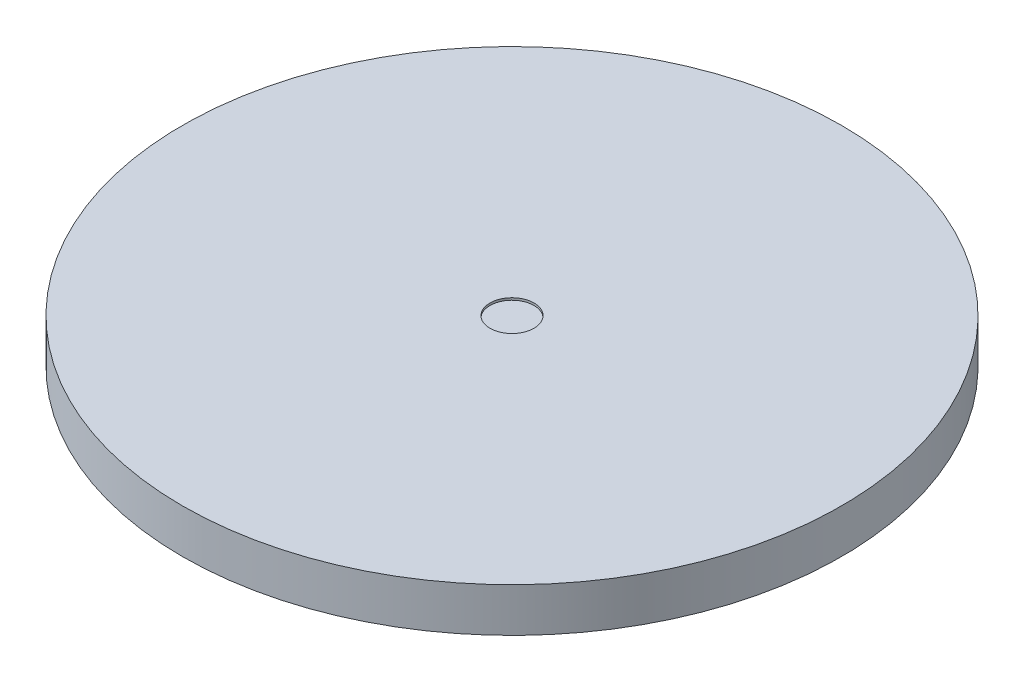
ISO-10303-21;
HEADER;
FILE_DESCRIPTION(('STEP AP214'),'2;1');
FILE_NAME('part.step','',(''),(''),'','','');
FILE_SCHEMA(('AUTOMOTIVE_DESIGN { 1 0 10303 214 1 1 1 1 }'));
ENDSEC;
DATA;
#1=APPLICATION_CONTEXT('core data for automotive mechanical design processes');
#2=APPLICATION_PROTOCOL_DEFINITION('international standard','automotive_design',2000,#1);
#3=PRODUCT_CONTEXT('',#1,'mechanical');
#4=PRODUCT('Part','Part','',(#3));
#5=PRODUCT_RELATED_PRODUCT_CATEGORY('part','',(#4));
#6=PRODUCT_DEFINITION_FORMATION('','',#4);
#7=PRODUCT_DEFINITION_CONTEXT('part definition',#1,'design');
#8=PRODUCT_DEFINITION('design','',#6,#7);
#9=PRODUCT_DEFINITION_SHAPE('','',#8);
#10=(LENGTH_UNIT() NAMED_UNIT(*) SI_UNIT(.MILLI.,.METRE.));
#11=(NAMED_UNIT(*) PLANE_ANGLE_UNIT() SI_UNIT($,.RADIAN.));
#12=(NAMED_UNIT(*) SI_UNIT($,.STERADIAN.) SOLID_ANGLE_UNIT());
#13=UNCERTAINTY_MEASURE_WITH_UNIT(LENGTH_MEASURE(1.E-05),#10,'distance_accuracy_value','');
#14=(GEOMETRIC_REPRESENTATION_CONTEXT(3) GLOBAL_UNCERTAINTY_ASSIGNED_CONTEXT((#13)) GLOBAL_UNIT_ASSIGNED_CONTEXT((#10,
#11,#12)) REPRESENTATION_CONTEXT('',''));
#15=CARTESIAN_POINT('',(0.,0.,0.));
#16=DIRECTION('',(0.,0.,1.));
#17=DIRECTION('',(1.,0.,0.));
#18=AXIS2_PLACEMENT_3D('',#15,#16,#17);
#19=CARTESIAN_POINT('',(0.,4.,0.));
#20=DIRECTION('',(0.,-1.,0.));
#21=DIRECTION('',(0.,0.,-1.));
#22=AXIS2_PLACEMENT_3D('',#19,#20,#21);
#23=CYLINDRICAL_SURFACE('',#22,30.);
#24=CARTESIAN_POINT('',(0.,4.,0.));
#25=DIRECTION('',(0.,1.,0.));
#26=DIRECTION('',(0.,0.,1.));
#27=AXIS2_PLACEMENT_3D('',#24,#25,#26);
#28=CIRCLE('',#27,30.);
#29=CARTESIAN_POINT('',(0.,4.,30.));
#30=VERTEX_POINT('',#29);
#31=EDGE_CURVE('E10',#30,#30,#28,.T.);
#32=ORIENTED_EDGE('',*,*,#31,.F.);
#33=EDGE_LOOP('',(#32));
#34=FACE_BOUND('',#33,.T.);
#35=CARTESIAN_POINT('',(0.,0.,0.));
#36=DIRECTION('',(0.,1.,0.));
#37=DIRECTION('',(0.,0.,1.));
#38=AXIS2_PLACEMENT_3D('',#35,#36,#37);
#39=CIRCLE('',#38,30.);
#40=CARTESIAN_POINT('',(0.,0.,30.));
#41=VERTEX_POINT('',#40);
#42=EDGE_CURVE('E40',#41,#41,#39,.T.);
#43=ORIENTED_EDGE('',*,*,#42,.T.);
#44=EDGE_LOOP('',(#43));
#45=FACE_BOUND('',#44,.T.);
#46=ADVANCED_FACE('F37',(#34,#45),#23,.T.);
#47=CARTESIAN_POINT('',(0.,4.,0.));
#48=DIRECTION('',(0.,1.,0.));
#49=DIRECTION('',(0.,0.,1.));
#50=AXIS2_PLACEMENT_3D('',#47,#48,#49);
#51=PLANE('',#50);
#52=CARTESIAN_POINT('',(0.,4.,0.));
#53=DIRECTION('',(0.,1.,0.));
#54=DIRECTION('',(0.,0.,1.));
#55=AXIS2_PLACEMENT_3D('',#52,#53,#54);
#56=CIRCLE('',#55,2.);
#57=CARTESIAN_POINT('',(0.,4.,2.));
#58=VERTEX_POINT('',#57);
#59=EDGE_CURVE('E51',#58,#58,#56,.T.);
#60=ORIENTED_EDGE('',*,*,#59,.F.);
#61=EDGE_LOOP('',(#60));
#62=FACE_BOUND('',#61,.T.);
#63=ORIENTED_EDGE('',*,*,#31,.T.);
#64=EDGE_LOOP('',(#63));
#65=FACE_BOUND('',#64,.T.);
#66=ADVANCED_FACE('F68',(#62,#65),#51,.T.);
#67=CARTESIAN_POINT('',(0.,0.,0.));
#68=DIRECTION('',(0.,1.,0.));
#69=DIRECTION('',(0.,0.,1.));
#70=AXIS2_PLACEMENT_3D('',#67,#68,#69);
#71=PLANE('',#70);
#72=ORIENTED_EDGE('',*,*,#42,.F.);
#73=EDGE_LOOP('',(#72));
#74=FACE_BOUND('',#73,.T.);
#75=ADVANCED_FACE('F64',(#74),#71,.F.);
#76=CARTESIAN_POINT('',(0.,3.8,0.));
#77=DIRECTION('',(0.,1.,0.));
#78=DIRECTION('',(0.,0.,1.));
#79=AXIS2_PLACEMENT_3D('',#76,#77,#78);
#80=CYLINDRICAL_SURFACE('',#79,2.);
#81=CARTESIAN_POINT('',(0.,3.8,0.));
#82=DIRECTION('',(0.,1.,0.));
#83=DIRECTION('',(0.,0.,1.));
#84=AXIS2_PLACEMENT_3D('',#81,#82,#83);
#85=CIRCLE('',#84,2.);
#86=CARTESIAN_POINT('',(0.,3.8,2.));
#87=VERTEX_POINT('',#86);
#88=EDGE_CURVE('E49',#87,#87,#85,.T.);
#89=ORIENTED_EDGE('',*,*,#88,.F.);
#90=EDGE_LOOP('',(#89));
#91=FACE_BOUND('',#90,.T.);
#92=ORIENTED_EDGE('',*,*,#59,.T.);
#93=EDGE_LOOP('',(#92));
#94=FACE_BOUND('',#93,.T.);
#95=ADVANCED_FACE('F61',(#91,#94),#80,.F.);
#96=CARTESIAN_POINT('',(0.,3.8,0.));
#97=DIRECTION('',(0.,1.,0.));
#98=DIRECTION('',(0.,0.,1.));
#99=AXIS2_PLACEMENT_3D('',#96,#97,#98);
#100=PLANE('',#99);
#101=ORIENTED_EDGE('',*,*,#88,.T.);
#102=EDGE_LOOP('',(#101));
#103=FACE_BOUND('',#102,.T.);
#104=ADVANCED_FACE('F59',(#103),#100,.T.);
#105=CLOSED_SHELL('',(#46,#66,#75,#95,#104));
#106=MANIFOLD_SOLID_BREP('B2',#105);
#107=ADVANCED_BREP_SHAPE_REPRESENTATION('',(#18,#106),#14);
#108=SHAPE_DEFINITION_REPRESENTATION(#9,#107);
ENDSEC;
END-ISO-10303-21;
